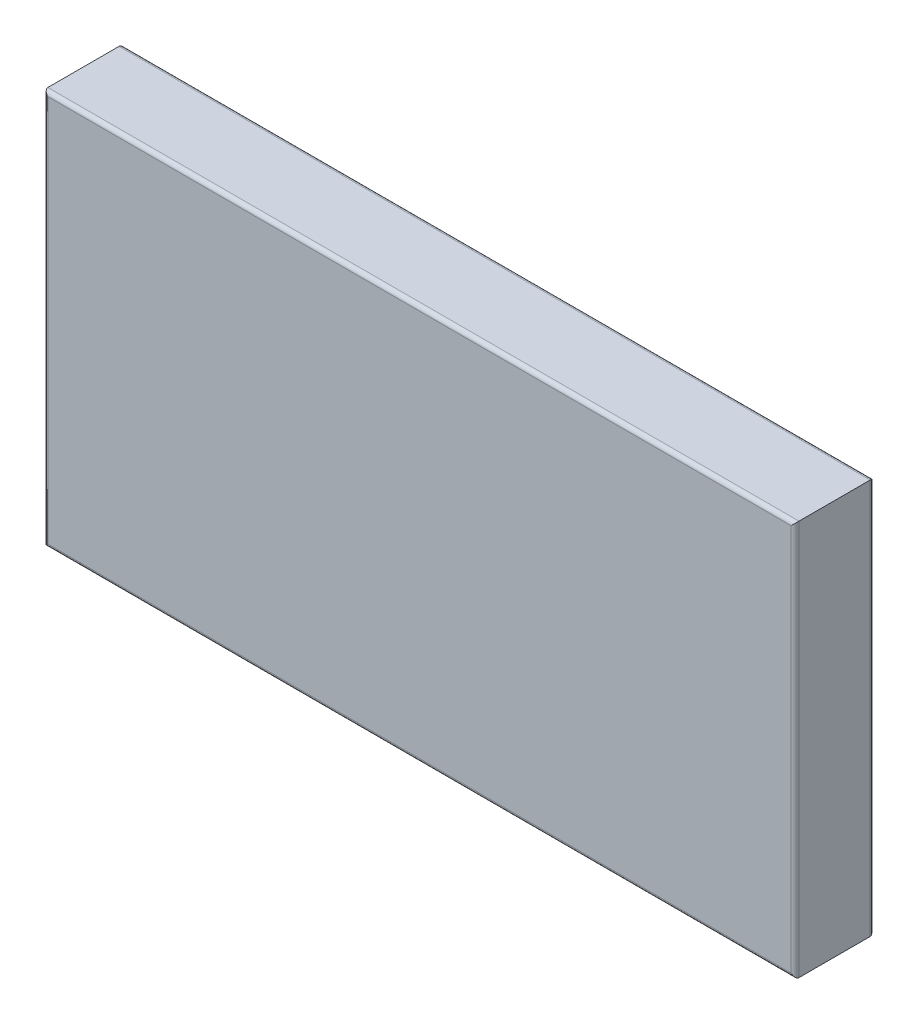
ISO-10303-21;
HEADER;
FILE_DESCRIPTION(('STEP AP214'),'2;1');
FILE_NAME('part.step','',(''),(''),'','','');
FILE_SCHEMA(('AUTOMOTIVE_DESIGN { 1 0 10303 214 1 1 1 1 }'));
ENDSEC;
DATA;
#1=APPLICATION_CONTEXT('core data for automotive mechanical design processes');
#2=APPLICATION_PROTOCOL_DEFINITION('international standard','automotive_design',2000,#1);
#3=PRODUCT_CONTEXT('',#1,'mechanical');
#4=PRODUCT('Part','Part','',(#3));
#5=PRODUCT_RELATED_PRODUCT_CATEGORY('part','',(#4));
#6=PRODUCT_DEFINITION_FORMATION('','',#4);
#7=PRODUCT_DEFINITION_CONTEXT('part definition',#1,'design');
#8=PRODUCT_DEFINITION('design','',#6,#7);
#9=PRODUCT_DEFINITION_SHAPE('','',#8);
#10=(LENGTH_UNIT() NAMED_UNIT(*) SI_UNIT(.MILLI.,.METRE.));
#11=(NAMED_UNIT(*) PLANE_ANGLE_UNIT() SI_UNIT($,.RADIAN.));
#12=(NAMED_UNIT(*) SI_UNIT($,.STERADIAN.) SOLID_ANGLE_UNIT());
#13=UNCERTAINTY_MEASURE_WITH_UNIT(LENGTH_MEASURE(1.E-05),#10,'distance_accuracy_value','');
#14=(GEOMETRIC_REPRESENTATION_CONTEXT(3) GLOBAL_UNCERTAINTY_ASSIGNED_CONTEXT((#13)) GLOBAL_UNIT_ASSIGNED_CONTEXT((#10,
#11,#12)) REPRESENTATION_CONTEXT('',''));
#15=CARTESIAN_POINT('',(0.,0.,0.));
#16=DIRECTION('',(0.,0.,1.));
#17=DIRECTION('',(1.,0.,0.));
#18=AXIS2_PLACEMENT_3D('',#15,#16,#17);
#19=CARTESIAN_POINT('',(0.,0.,200.));
#20=DIRECTION('',(1.,0.,0.));
#21=DIRECTION('',(0.,0.,-1.));
#22=AXIS2_PLACEMENT_3D('',#19,#20,#21);
#23=PLANE('',#22);
#24=DIRECTION('',(0.,0.,-1.));
#25=VECTOR('',#24,1.);
#26=CARTESIAN_POINT('',(0.,1000.,200.));
#27=LINE('',#26,#25);
#28=CARTESIAN_POINT('',(0.,1000.,190.));
#29=VERTEX_POINT('',#28);
#30=CARTESIAN_POINT('',(0.,1000.,10.));
#31=VERTEX_POINT('',#30);
#32=EDGE_CURVE('E170',#29,#31,#27,.T.);
#33=ORIENTED_EDGE('',*,*,#32,.T.);
#34=DIRECTION('',(0.,-1.,0.));
#35=VECTOR('',#34,1.);
#36=CARTESIAN_POINT('',(0.,0.,10.));
#37=LINE('',#36,#35);
#38=CARTESIAN_POINT('',(0.,0.,10.));
#39=VERTEX_POINT('',#38);
#40=EDGE_CURVE('E135',#31,#39,#37,.T.);
#41=ORIENTED_EDGE('',*,*,#40,.T.);
#42=DIRECTION('',(0.,0.,-1.));
#43=VECTOR('',#42,1.);
#44=CARTESIAN_POINT('',(0.,0.,200.));
#45=LINE('',#44,#43);
#46=CARTESIAN_POINT('',(0.,0.,190.));
#47=VERTEX_POINT('',#46);
#48=EDGE_CURVE('E111',#47,#39,#45,.T.);
#49=ORIENTED_EDGE('',*,*,#48,.F.);
#50=DIRECTION('',(0.,-1.,0.));
#51=VECTOR('',#50,1.);
#52=CARTESIAN_POINT('',(0.,0.,190.));
#53=LINE('',#52,#51);
#54=EDGE_CURVE('E129',#47,#29,#53,.F.);
#55=ORIENTED_EDGE('',*,*,#54,.T.);
#56=EDGE_LOOP('',(#33,#41,#49,#55));
#57=FACE_BOUND('',#56,.T.);
#58=ADVANCED_FACE('F44',(#57),#23,.F.);
#59=CARTESIAN_POINT('',(0.,0.,200.));
#60=DIRECTION('',(0.,1.,0.));
#61=DIRECTION('',(0.,0.,1.));
#62=AXIS2_PLACEMENT_3D('',#59,#60,#61);
#63=PLANE('',#62);
#64=ORIENTED_EDGE('',*,*,#48,.T.);
#65=DIRECTION('',(1.,0.,0.));
#66=VECTOR('',#65,1.);
#67=CARTESIAN_POINT('',(1900.,0.,10.));
#68=LINE('',#67,#66);
#69=CARTESIAN_POINT('',(1900.,0.,10.));
#70=VERTEX_POINT('',#69);
#71=EDGE_CURVE('E121',#39,#70,#68,.T.);
#72=ORIENTED_EDGE('',*,*,#71,.T.);
#73=DIRECTION('',(0.,0.,-1.));
#74=VECTOR('',#73,1.);
#75=CARTESIAN_POINT('',(1900.,0.,200.));
#76=LINE('',#75,#74);
#77=CARTESIAN_POINT('',(1900.,0.,190.));
#78=VERTEX_POINT('',#77);
#79=EDGE_CURVE('E116',#78,#70,#76,.T.);
#80=ORIENTED_EDGE('',*,*,#79,.F.);
#81=DIRECTION('',(1.,0.,0.));
#82=VECTOR('',#81,1.);
#83=CARTESIAN_POINT('',(0.,0.,190.));
#84=LINE('',#83,#82);
#85=EDGE_CURVE('E112',#78,#47,#84,.F.);
#86=ORIENTED_EDGE('',*,*,#85,.T.);
#87=EDGE_LOOP('',(#64,#72,#80,#86));
#88=FACE_BOUND('',#87,.T.);
#89=ADVANCED_FACE('F114',(#88),#63,.F.);
#90=CARTESIAN_POINT('',(1900.,0.,200.));
#91=DIRECTION('',(-1.,0.,0.));
#92=DIRECTION('',(0.,-1.,0.));
#93=AXIS2_PLACEMENT_3D('',#90,#91,#92);
#94=PLANE('',#93);
#95=ORIENTED_EDGE('',*,*,#79,.T.);
#96=DIRECTION('',(0.,1.,0.));
#97=VECTOR('',#96,1.);
#98=CARTESIAN_POINT('',(1900.,1000.,10.));
#99=LINE('',#98,#97);
#100=CARTESIAN_POINT('',(1900.,1000.,10.));
#101=VERTEX_POINT('',#100);
#102=EDGE_CURVE('E125',#70,#101,#99,.T.);
#103=ORIENTED_EDGE('',*,*,#102,.T.);
#104=DIRECTION('',(0.,0.,-1.));
#105=VECTOR('',#104,1.);
#106=CARTESIAN_POINT('',(1900.,1000.,200.));
#107=LINE('',#106,#105);
#108=CARTESIAN_POINT('',(1900.,1000.,190.));
#109=VERTEX_POINT('',#108);
#110=EDGE_CURVE('E175',#109,#101,#107,.T.);
#111=ORIENTED_EDGE('',*,*,#110,.F.);
#112=DIRECTION('',(0.,1.,0.));
#113=VECTOR('',#112,1.);
#114=CARTESIAN_POINT('',(1900.,0.,190.));
#115=LINE('',#114,#113);
#116=EDGE_CURVE('E192',#109,#78,#115,.F.);
#117=ORIENTED_EDGE('',*,*,#116,.T.);
#118=EDGE_LOOP('',(#95,#103,#111,#117));
#119=FACE_BOUND('',#118,.T.);
#120=ADVANCED_FACE('F206',(#119),#94,.F.);
#121=CARTESIAN_POINT('',(0.,1000.,200.));
#122=DIRECTION('',(0.,-1.,0.));
#123=DIRECTION('',(0.,0.,-1.));
#124=AXIS2_PLACEMENT_3D('',#121,#122,#123);
#125=PLANE('',#124);
#126=ORIENTED_EDGE('',*,*,#110,.T.);
#127=DIRECTION('',(-1.,0.,0.));
#128=VECTOR('',#127,1.);
#129=CARTESIAN_POINT('',(0.,1000.,10.));
#130=LINE('',#129,#128);
#131=EDGE_CURVE('E191',#101,#31,#130,.T.);
#132=ORIENTED_EDGE('',*,*,#131,.T.);
#133=ORIENTED_EDGE('',*,*,#32,.F.);
#134=DIRECTION('',(-1.,0.,0.));
#135=VECTOR('',#134,1.);
#136=CARTESIAN_POINT('',(0.,1000.,190.));
#137=LINE('',#136,#135);
#138=EDGE_CURVE('E188',#29,#109,#137,.F.);
#139=ORIENTED_EDGE('',*,*,#138,.T.);
#140=EDGE_LOOP('',(#126,#132,#133,#139));
#141=FACE_BOUND('',#140,.T.);
#142=ADVANCED_FACE('F204',(#141),#125,.F.);
#143=CARTESIAN_POINT('',(0.,0.,200.));
#144=DIRECTION('',(0.,0.,-1.));
#145=DIRECTION('',(-1.,0.,0.));
#146=AXIS2_PLACEMENT_3D('',#143,#144,#145);
#147=PLANE('',#146);
#148=DIRECTION('',(-1.,0.,0.));
#149=VECTOR('',#148,1.);
#150=CARTESIAN_POINT('',(0.,990.,200.));
#151=LINE('',#150,#149);
#152=CARTESIAN_POINT('',(1890.,990.,200.));
#153=VERTEX_POINT('',#152);
#154=CARTESIAN_POINT('',(10.,990.,200.));
#155=VERTEX_POINT('',#154);
#156=EDGE_CURVE('E53',#153,#155,#151,.T.);
#157=ORIENTED_EDGE('',*,*,#156,.T.);
#158=DIRECTION('',(0.,-1.,0.));
#159=VECTOR('',#158,1.);
#160=CARTESIAN_POINT('',(10.,0.,200.));
#161=LINE('',#160,#159);
#162=CARTESIAN_POINT('',(10.,10.,200.));
#163=VERTEX_POINT('',#162);
#164=EDGE_CURVE('E11',#155,#163,#161,.T.);
#165=ORIENTED_EDGE('',*,*,#164,.T.);
#166=DIRECTION('',(1.,0.,0.));
#167=VECTOR('',#166,1.);
#168=CARTESIAN_POINT('',(0.,10.,200.));
#169=LINE('',#168,#167);
#170=CARTESIAN_POINT('',(1890.,10.,200.));
#171=VERTEX_POINT('',#170);
#172=EDGE_CURVE('E141',#163,#171,#169,.T.);
#173=ORIENTED_EDGE('',*,*,#172,.T.);
#174=DIRECTION('',(0.,1.,0.));
#175=VECTOR('',#174,1.);
#176=CARTESIAN_POINT('',(1890.,-1.04916075827077E-12,200.));
#177=LINE('',#176,#175);
#178=EDGE_CURVE('E64',#171,#153,#177,.T.);
#179=ORIENTED_EDGE('',*,*,#178,.T.);
#180=EDGE_LOOP('',(#157,#165,#173,#179));
#181=FACE_BOUND('',#180,.T.);
#182=ADVANCED_FACE('F196',(#181),#147,.F.);
#183=CARTESIAN_POINT('',(0.,0.,0.));
#184=DIRECTION('',(0.,0.,-1.));
#185=DIRECTION('',(-1.,0.,0.));
#186=AXIS2_PLACEMENT_3D('',#183,#184,#185);
#187=PLANE('',#186);
#188=DIRECTION('',(1.,0.,0.));
#189=VECTOR('',#188,1.);
#190=CARTESIAN_POINT('',(0.,10.,0.));
#191=LINE('',#190,#189);
#192=CARTESIAN_POINT('',(1890.,10.,0.));
#193=VERTEX_POINT('',#192);
#194=CARTESIAN_POINT('',(10.,10.,0.));
#195=VERTEX_POINT('',#194);
#196=EDGE_CURVE('E179',#193,#195,#191,.F.);
#197=ORIENTED_EDGE('',*,*,#196,.T.);
#198=DIRECTION('',(0.,-1.,0.));
#199=VECTOR('',#198,1.);
#200=CARTESIAN_POINT('',(10.,1000.,0.));
#201=LINE('',#200,#199);
#202=CARTESIAN_POINT('',(10.,990.,0.));
#203=VERTEX_POINT('',#202);
#204=EDGE_CURVE('E186',#195,#203,#201,.F.);
#205=ORIENTED_EDGE('',*,*,#204,.T.);
#206=DIRECTION('',(-1.,0.,0.));
#207=VECTOR('',#206,1.);
#208=CARTESIAN_POINT('',(1900.,990.,0.));
#209=LINE('',#208,#207);
#210=CARTESIAN_POINT('',(1890.,990.,0.));
#211=VERTEX_POINT('',#210);
#212=EDGE_CURVE('E184',#203,#211,#209,.F.);
#213=ORIENTED_EDGE('',*,*,#212,.T.);
#214=DIRECTION('',(0.,1.,0.));
#215=VECTOR('',#214,1.);
#216=CARTESIAN_POINT('',(1890.,0.,0.));
#217=LINE('',#216,#215);
#218=EDGE_CURVE('E185',#211,#193,#217,.F.);
#219=ORIENTED_EDGE('',*,*,#218,.T.);
#220=EDGE_LOOP('',(#197,#205,#213,#219));
#221=FACE_BOUND('',#220,.T.);
#222=ADVANCED_FACE('F235',(#221),#187,.T.);
#223=CARTESIAN_POINT('',(1890.,0.,10.));
#224=DIRECTION('',(0.,-1.,0.));
#225=DIRECTION('',(1.,0.,0.));
#226=AXIS2_PLACEMENT_3D('',#223,#224,#225);
#227=CYLINDRICAL_SURFACE('',#226,10.);
#228=CARTESIAN_POINT('',(1890.,10.,10.));
#229=DIRECTION('',(-0.707106781186548,-0.707106781186547,0.));
#230=DIRECTION('',(-0.707106781186547,0.707106781186548,0.));
#231=AXIS2_PLACEMENT_3D('',#228,#229,#230);
#232=ELLIPSE('',#231,14.1421356237309,10.);
#233=EDGE_CURVE('E157',#193,#70,#232,.T.);
#234=ORIENTED_EDGE('',*,*,#233,.F.);
#235=ORIENTED_EDGE('',*,*,#218,.F.);
#236=CARTESIAN_POINT('',(1890.,990.,10.));
#237=DIRECTION('',(0.707106781186547,-0.707106781186548,0.));
#238=DIRECTION('',(-0.707106781186548,-0.707106781186547,0.));
#239=AXIS2_PLACEMENT_3D('',#236,#237,#238);
#240=ELLIPSE('',#239,14.142135623731,10.);
#241=EDGE_CURVE('E146',#101,#211,#240,.F.);
#242=ORIENTED_EDGE('',*,*,#241,.F.);
#243=ORIENTED_EDGE('',*,*,#102,.F.);
#244=EDGE_LOOP('',(#234,#235,#242,#243));
#245=FACE_BOUND('',#244,.T.);
#246=ADVANCED_FACE('F207',(#245),#227,.T.);
#247=CARTESIAN_POINT('',(0.,990.,10.));
#248=DIRECTION('',(1.,0.,0.));
#249=DIRECTION('',(0.,0.,-1.));
#250=AXIS2_PLACEMENT_3D('',#247,#248,#249);
#251=CYLINDRICAL_SURFACE('',#250,10.);
#252=ORIENTED_EDGE('',*,*,#241,.T.);
#253=ORIENTED_EDGE('',*,*,#212,.F.);
#254=CARTESIAN_POINT('',(10.,990.,10.));
#255=DIRECTION('',(0.707106781186547,0.707106781186547,0.));
#256=DIRECTION('',(0.707106781186547,-0.707106781186547,0.));
#257=AXIS2_PLACEMENT_3D('',#254,#255,#256);
#258=ELLIPSE('',#257,14.142135623731,10.);
#259=EDGE_CURVE('E153',#31,#203,#258,.F.);
#260=ORIENTED_EDGE('',*,*,#259,.F.);
#261=ORIENTED_EDGE('',*,*,#131,.F.);
#262=EDGE_LOOP('',(#252,#253,#260,#261));
#263=FACE_BOUND('',#262,.T.);
#264=ADVANCED_FACE('F211',(#263),#251,.T.);
#265=CARTESIAN_POINT('',(0.,10.,10.));
#266=DIRECTION('',(-1.,0.,0.));
#267=DIRECTION('',(0.,0.,1.));
#268=AXIS2_PLACEMENT_3D('',#265,#266,#267);
#269=CYLINDRICAL_SURFACE('',#268,10.);
#270=ORIENTED_EDGE('',*,*,#233,.T.);
#271=ORIENTED_EDGE('',*,*,#71,.F.);
#272=CARTESIAN_POINT('',(10.,10.,10.));
#273=DIRECTION('',(-0.707106781186547,0.707106781186547,0.));
#274=DIRECTION('',(-0.707106781186547,-0.707106781186547,0.));
#275=AXIS2_PLACEMENT_3D('',#272,#273,#274);
#276=ELLIPSE('',#275,14.142135623731,10.);
#277=EDGE_CURVE('E151',#195,#39,#276,.T.);
#278=ORIENTED_EDGE('',*,*,#277,.F.);
#279=ORIENTED_EDGE('',*,*,#196,.F.);
#280=EDGE_LOOP('',(#270,#271,#278,#279));
#281=FACE_BOUND('',#280,.T.);
#282=ADVANCED_FACE('F212',(#281),#269,.T.);
#283=CARTESIAN_POINT('',(10.,0.,10.));
#284=DIRECTION('',(0.,1.,0.));
#285=DIRECTION('',(0.,0.,1.));
#286=AXIS2_PLACEMENT_3D('',#283,#284,#285);
#287=CYLINDRICAL_SURFACE('',#286,10.);
#288=ORIENTED_EDGE('',*,*,#259,.T.);
#289=ORIENTED_EDGE('',*,*,#204,.F.);
#290=ORIENTED_EDGE('',*,*,#277,.T.);
#291=ORIENTED_EDGE('',*,*,#40,.F.);
#292=EDGE_LOOP('',(#288,#289,#290,#291));
#293=FACE_BOUND('',#292,.T.);
#294=ADVANCED_FACE('F215',(#293),#287,.T.);
#295=CARTESIAN_POINT('',(1890.,-1.04916075827077E-12,190.));
#296=DIRECTION('',(0.,1.,0.));
#297=DIRECTION('',(-1.,0.,0.));
#298=AXIS2_PLACEMENT_3D('',#295,#296,#297);
#299=CYLINDRICAL_SURFACE('',#298,10.);
#300=CARTESIAN_POINT('',(1890.,10.,190.));
#301=DIRECTION('',(0.707106781186548,0.707106781186547,0.));
#302=DIRECTION('',(0.707106781186547,-0.707106781186548,0.));
#303=AXIS2_PLACEMENT_3D('',#300,#301,#302);
#304=ELLIPSE('',#303,14.1421356237309,10.);
#305=EDGE_CURVE('E144',#78,#171,#304,.F.);
#306=ORIENTED_EDGE('',*,*,#305,.F.);
#307=ORIENTED_EDGE('',*,*,#116,.F.);
#308=CARTESIAN_POINT('',(1890.,990.,190.));
#309=DIRECTION('',(-0.707106781186547,0.707106781186548,0.));
#310=DIRECTION('',(0.707106781186548,0.707106781186547,0.));
#311=AXIS2_PLACEMENT_3D('',#308,#309,#310);
#312=ELLIPSE('',#311,14.142135623731,10.);
#313=EDGE_CURVE('E47',#153,#109,#312,.T.);
#314=ORIENTED_EDGE('',*,*,#313,.F.);
#315=ORIENTED_EDGE('',*,*,#178,.F.);
#316=EDGE_LOOP('',(#306,#307,#314,#315));
#317=FACE_BOUND('',#316,.T.);
#318=ADVANCED_FACE('F50',(#317),#299,.T.);
#319=CARTESIAN_POINT('',(0.,990.,190.));
#320=DIRECTION('',(-1.,0.,0.));
#321=DIRECTION('',(0.,0.,1.));
#322=AXIS2_PLACEMENT_3D('',#319,#320,#321);
#323=CYLINDRICAL_SURFACE('',#322,10.);
#324=ORIENTED_EDGE('',*,*,#313,.T.);
#325=ORIENTED_EDGE('',*,*,#138,.F.);
#326=CARTESIAN_POINT('',(10.,990.,190.));
#327=DIRECTION('',(-0.707106781186547,-0.707106781186547,0.));
#328=DIRECTION('',(-0.707106781186547,0.707106781186547,0.));
#329=AXIS2_PLACEMENT_3D('',#326,#327,#328);
#330=ELLIPSE('',#329,14.142135623731,10.);
#331=EDGE_CURVE('E138',#155,#29,#330,.T.);
#332=ORIENTED_EDGE('',*,*,#331,.F.);
#333=ORIENTED_EDGE('',*,*,#156,.F.);
#334=EDGE_LOOP('',(#324,#325,#332,#333));
#335=FACE_BOUND('',#334,.T.);
#336=ADVANCED_FACE('F203',(#335),#323,.T.);
#337=CARTESIAN_POINT('',(0.,10.,190.));
#338=DIRECTION('',(1.,0.,0.));
#339=DIRECTION('',(0.,0.,-1.));
#340=AXIS2_PLACEMENT_3D('',#337,#338,#339);
#341=CYLINDRICAL_SURFACE('',#340,10.);
#342=ORIENTED_EDGE('',*,*,#305,.T.);
#343=ORIENTED_EDGE('',*,*,#172,.F.);
#344=CARTESIAN_POINT('',(10.,10.,190.));
#345=DIRECTION('',(0.707106781186547,-0.707106781186547,0.));
#346=DIRECTION('',(0.707106781186547,0.707106781186547,0.));
#347=AXIS2_PLACEMENT_3D('',#344,#345,#346);
#348=ELLIPSE('',#347,14.142135623731,10.);
#349=EDGE_CURVE('E140',#47,#163,#348,.F.);
#350=ORIENTED_EDGE('',*,*,#349,.F.);
#351=ORIENTED_EDGE('',*,*,#85,.F.);
#352=EDGE_LOOP('',(#342,#343,#350,#351));
#353=FACE_BOUND('',#352,.T.);
#354=ADVANCED_FACE('F142',(#353),#341,.T.);
#355=CARTESIAN_POINT('',(10.,0.,190.));
#356=DIRECTION('',(0.,-1.,0.));
#357=DIRECTION('',(0.,0.,-1.));
#358=AXIS2_PLACEMENT_3D('',#355,#356,#357);
#359=CYLINDRICAL_SURFACE('',#358,10.);
#360=ORIENTED_EDGE('',*,*,#331,.T.);
#361=ORIENTED_EDGE('',*,*,#54,.F.);
#362=ORIENTED_EDGE('',*,*,#349,.T.);
#363=ORIENTED_EDGE('',*,*,#164,.F.);
#364=EDGE_LOOP('',(#360,#361,#362,#363));
#365=FACE_BOUND('',#364,.T.);
#366=ADVANCED_FACE('F134',(#365),#359,.T.);
#367=CLOSED_SHELL('',(#58,#89,#120,#142,#182,#222,#246,#264,#282,#294,#318,#336,#354,#366));
#368=MANIFOLD_SOLID_BREP('B2',#367);
#369=ADVANCED_BREP_SHAPE_REPRESENTATION('',(#18,#368),#14);
#370=SHAPE_DEFINITION_REPRESENTATION(#9,#369);
ENDSEC;
END-ISO-10303-21;
